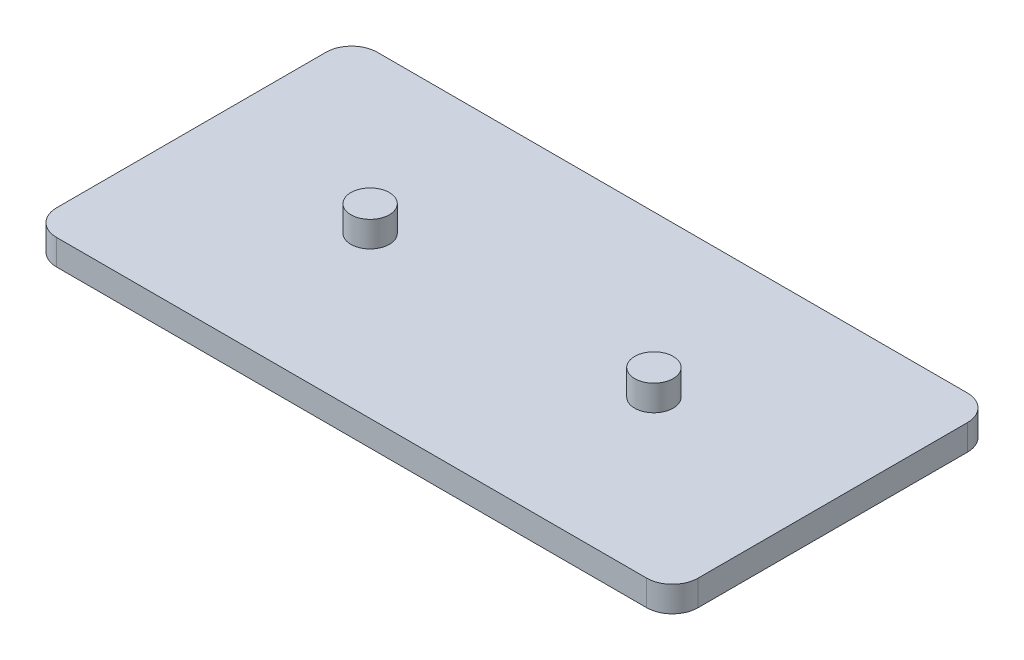
ISO-10303-21;
HEADER;
FILE_DESCRIPTION(('STEP AP214'),'2;1');
FILE_NAME('part.step','',(''),(''),'','','');
FILE_SCHEMA(('AUTOMOTIVE_DESIGN { 1 0 10303 214 1 1 1 1 }'));
ENDSEC;
DATA;
#1=APPLICATION_CONTEXT('core data for automotive mechanical design processes');
#2=APPLICATION_PROTOCOL_DEFINITION('international standard','automotive_design',2000,#1);
#3=PRODUCT_CONTEXT('',#1,'mechanical');
#4=PRODUCT('Part','Part','',(#3));
#5=PRODUCT_RELATED_PRODUCT_CATEGORY('part','',(#4));
#6=PRODUCT_DEFINITION_FORMATION('','',#4);
#7=PRODUCT_DEFINITION_CONTEXT('part definition',#1,'design');
#8=PRODUCT_DEFINITION('design','',#6,#7);
#9=PRODUCT_DEFINITION_SHAPE('','',#8);
#10=(LENGTH_UNIT() NAMED_UNIT(*) SI_UNIT(.MILLI.,.METRE.));
#11=(NAMED_UNIT(*) PLANE_ANGLE_UNIT() SI_UNIT($,.RADIAN.));
#12=(NAMED_UNIT(*) SI_UNIT($,.STERADIAN.) SOLID_ANGLE_UNIT());
#13=UNCERTAINTY_MEASURE_WITH_UNIT(LENGTH_MEASURE(1.E-05),#10,'distance_accuracy_value','');
#14=(GEOMETRIC_REPRESENTATION_CONTEXT(3) GLOBAL_UNCERTAINTY_ASSIGNED_CONTEXT((#13)) GLOBAL_UNIT_ASSIGNED_CONTEXT((#10,
#11,#12)) REPRESENTATION_CONTEXT('',''));
#15=CARTESIAN_POINT('',(0.,0.,0.));
#16=DIRECTION('',(0.,0.,1.));
#17=DIRECTION('',(1.,0.,0.));
#18=AXIS2_PLACEMENT_3D('',#15,#16,#17);
#19=CARTESIAN_POINT('',(317.5,25.4,-158.75));
#20=DIRECTION('',(-1.,0.,0.));
#21=DIRECTION('',(0.,0.,1.));
#22=AXIS2_PLACEMENT_3D('',#19,#20,#21);
#23=PLANE('',#22);
#24=DIRECTION('',(0.,0.,-1.));
#25=VECTOR('',#24,1.);
#26=CARTESIAN_POINT('',(317.5,0.,-158.75));
#27=LINE('',#26,#25);
#28=CARTESIAN_POINT('',(317.5,0.,133.35));
#29=VERTEX_POINT('',#28);
#30=CARTESIAN_POINT('',(317.5,0.,-133.35));
#31=VERTEX_POINT('',#30);
#32=EDGE_CURVE('E157',#29,#31,#27,.T.);
#33=ORIENTED_EDGE('',*,*,#32,.T.);
#34=DIRECTION('',(0.,-1.,0.));
#35=VECTOR('',#34,1.);
#36=CARTESIAN_POINT('',(317.5,25.4,-133.35));
#37=LINE('',#36,#35);
#38=CARTESIAN_POINT('',(317.5,25.4,-133.35));
#39=VERTEX_POINT('',#38);
#40=EDGE_CURVE('E11',#31,#39,#37,.F.);
#41=ORIENTED_EDGE('',*,*,#40,.T.);
#42=DIRECTION('',(0.,0.,-1.));
#43=VECTOR('',#42,1.);
#44=CARTESIAN_POINT('',(317.5,25.4,-158.75));
#45=LINE('',#44,#43);
#46=CARTESIAN_POINT('',(317.5,25.4,133.35));
#47=VERTEX_POINT('',#46);
#48=EDGE_CURVE('E125',#47,#39,#45,.T.);
#49=ORIENTED_EDGE('',*,*,#48,.F.);
#50=DIRECTION('',(0.,-1.,0.));
#51=VECTOR('',#50,1.);
#52=CARTESIAN_POINT('',(317.5,25.4,133.35));
#53=LINE('',#52,#51);
#54=EDGE_CURVE('E41',#47,#29,#53,.T.);
#55=ORIENTED_EDGE('',*,*,#54,.T.);
#56=EDGE_LOOP('',(#33,#41,#49,#55));
#57=FACE_BOUND('',#56,.T.);
#58=ADVANCED_FACE('F33',(#57),#23,.F.);
#59=CARTESIAN_POINT('',(-317.5,25.4,-158.75));
#60=DIRECTION('',(0.,0.,1.));
#61=DIRECTION('',(1.,0.,0.));
#62=AXIS2_PLACEMENT_3D('',#59,#60,#61);
#63=PLANE('',#62);
#64=DIRECTION('',(-1.,0.,0.));
#65=VECTOR('',#64,1.);
#66=CARTESIAN_POINT('',(-317.5,0.,-158.75));
#67=LINE('',#66,#65);
#68=CARTESIAN_POINT('',(292.1,0.,-158.75));
#69=VERTEX_POINT('',#68);
#70=CARTESIAN_POINT('',(-292.1,0.,-158.75));
#71=VERTEX_POINT('',#70);
#72=EDGE_CURVE('E130',#69,#71,#67,.T.);
#73=ORIENTED_EDGE('',*,*,#72,.T.);
#74=DIRECTION('',(0.,-1.,0.));
#75=VECTOR('',#74,1.);
#76=CARTESIAN_POINT('',(-292.1,25.4,-158.75));
#77=LINE('',#76,#75);
#78=CARTESIAN_POINT('',(-292.1,25.4,-158.75));
#79=VERTEX_POINT('',#78);
#80=EDGE_CURVE('E48',#71,#79,#77,.F.);
#81=ORIENTED_EDGE('',*,*,#80,.T.);
#82=DIRECTION('',(-1.,0.,0.));
#83=VECTOR('',#82,1.);
#84=CARTESIAN_POINT('',(-317.5,25.4,-158.75));
#85=LINE('',#84,#83);
#86=CARTESIAN_POINT('',(292.1,25.4,-158.75));
#87=VERTEX_POINT('',#86);
#88=EDGE_CURVE('E128',#87,#79,#85,.T.);
#89=ORIENTED_EDGE('',*,*,#88,.F.);
#90=DIRECTION('',(0.,-1.,0.));
#91=VECTOR('',#90,1.);
#92=CARTESIAN_POINT('',(292.1,25.4,-158.75));
#93=LINE('',#92,#91);
#94=EDGE_CURVE('E149',#87,#69,#93,.T.);
#95=ORIENTED_EDGE('',*,*,#94,.T.);
#96=EDGE_LOOP('',(#73,#81,#89,#95));
#97=FACE_BOUND('',#96,.T.);
#98=ADVANCED_FACE('F203',(#97),#63,.F.);
#99=CARTESIAN_POINT('',(-317.5,25.4,-158.75));
#100=DIRECTION('',(1.,0.,0.));
#101=DIRECTION('',(0.,0.,-1.));
#102=AXIS2_PLACEMENT_3D('',#99,#100,#101);
#103=PLANE('',#102);
#104=DIRECTION('',(0.,0.,1.));
#105=VECTOR('',#104,1.);
#106=CARTESIAN_POINT('',(-317.5,0.,-158.75));
#107=LINE('',#106,#105);
#108=CARTESIAN_POINT('',(-317.5,0.,-133.35));
#109=VERTEX_POINT('',#108);
#110=CARTESIAN_POINT('',(-317.5,0.,133.35));
#111=VERTEX_POINT('',#110);
#112=EDGE_CURVE('E126',#109,#111,#107,.T.);
#113=ORIENTED_EDGE('',*,*,#112,.T.);
#114=DIRECTION('',(0.,-1.,0.));
#115=VECTOR('',#114,1.);
#116=CARTESIAN_POINT('',(-317.5,25.4,133.35));
#117=LINE('',#116,#115);
#118=CARTESIAN_POINT('',(-317.5,25.4,133.35));
#119=VERTEX_POINT('',#118);
#120=EDGE_CURVE('E104',#111,#119,#117,.F.);
#121=ORIENTED_EDGE('',*,*,#120,.T.);
#122=DIRECTION('',(0.,0.,1.));
#123=VECTOR('',#122,1.);
#124=CARTESIAN_POINT('',(-317.5,25.4,-158.75));
#125=LINE('',#124,#123);
#126=CARTESIAN_POINT('',(-317.5,25.4,-133.35));
#127=VERTEX_POINT('',#126);
#128=EDGE_CURVE('E169',#127,#119,#125,.T.);
#129=ORIENTED_EDGE('',*,*,#128,.F.);
#130=DIRECTION('',(0.,-1.,0.));
#131=VECTOR('',#130,1.);
#132=CARTESIAN_POINT('',(-317.5,25.4,-133.35));
#133=LINE('',#132,#131);
#134=EDGE_CURVE('E109',#127,#109,#133,.T.);
#135=ORIENTED_EDGE('',*,*,#134,.T.);
#136=EDGE_LOOP('',(#113,#121,#129,#135));
#137=FACE_BOUND('',#136,.T.);
#138=ADVANCED_FACE('F200',(#137),#103,.F.);
#139=CARTESIAN_POINT('',(-317.5,25.4,158.75));
#140=DIRECTION('',(0.,0.,-1.));
#141=DIRECTION('',(-1.,0.,0.));
#142=AXIS2_PLACEMENT_3D('',#139,#140,#141);
#143=PLANE('',#142);
#144=DIRECTION('',(1.,0.,0.));
#145=VECTOR('',#144,1.);
#146=CARTESIAN_POINT('',(-317.5,25.4,158.75));
#147=LINE('',#146,#145);
#148=CARTESIAN_POINT('',(-292.1,25.4,158.75));
#149=VERTEX_POINT('',#148);
#150=CARTESIAN_POINT('',(292.1,25.4,158.75));
#151=VERTEX_POINT('',#150);
#152=EDGE_CURVE('E119',#149,#151,#147,.T.);
#153=ORIENTED_EDGE('',*,*,#152,.F.);
#154=DIRECTION('',(0.,-1.,0.));
#155=VECTOR('',#154,1.);
#156=CARTESIAN_POINT('',(-292.1,25.4,158.75));
#157=LINE('',#156,#155);
#158=CARTESIAN_POINT('',(-292.1,0.,158.75));
#159=VERTEX_POINT('',#158);
#160=EDGE_CURVE('E103',#149,#159,#157,.T.);
#161=ORIENTED_EDGE('',*,*,#160,.T.);
#162=DIRECTION('',(1.,0.,0.));
#163=VECTOR('',#162,1.);
#164=CARTESIAN_POINT('',(-317.5,0.,158.75));
#165=LINE('',#164,#163);
#166=CARTESIAN_POINT('',(292.1,0.,158.75));
#167=VERTEX_POINT('',#166);
#168=EDGE_CURVE('E116',#159,#167,#165,.T.);
#169=ORIENTED_EDGE('',*,*,#168,.T.);
#170=DIRECTION('',(0.,-1.,0.));
#171=VECTOR('',#170,1.);
#172=CARTESIAN_POINT('',(292.1,25.4,158.75));
#173=LINE('',#172,#171);
#174=EDGE_CURVE('E121',#167,#151,#173,.F.);
#175=ORIENTED_EDGE('',*,*,#174,.T.);
#176=EDGE_LOOP('',(#153,#161,#169,#175));
#177=FACE_BOUND('',#176,.T.);
#178=ADVANCED_FACE('F115',(#177),#143,.F.);
#179=CARTESIAN_POINT('',(0.,25.4,0.));
#180=DIRECTION('',(0.,1.,0.));
#181=DIRECTION('',(0.,0.,1.));
#182=AXIS2_PLACEMENT_3D('',#179,#180,#181);
#183=PLANE('',#182);
#184=CARTESIAN_POINT('',(140.462,25.4,0.));
#185=DIRECTION('',(0.,1.,0.));
#186=DIRECTION('',(0.,0.,-1.));
#187=AXIS2_PLACEMENT_3D('',#184,#185,#186);
#188=CIRCLE('',#187,19.05);
#189=CARTESIAN_POINT('',(140.462,25.4,-19.05));
#190=VERTEX_POINT('',#189);
#191=EDGE_CURVE('E176',#190,#190,#188,.T.);
#192=ORIENTED_EDGE('',*,*,#191,.F.);
#193=EDGE_LOOP('',(#192));
#194=FACE_BOUND('',#193,.T.);
#195=CARTESIAN_POINT('',(-140.462,25.4,0.));
#196=DIRECTION('',(0.,1.,0.));
#197=DIRECTION('',(0.,0.,1.));
#198=AXIS2_PLACEMENT_3D('',#195,#196,#197);
#199=CIRCLE('',#198,19.05);
#200=CARTESIAN_POINT('',(-140.462,25.4,19.05));
#201=VERTEX_POINT('',#200);
#202=EDGE_CURVE('E165',#201,#201,#199,.T.);
#203=ORIENTED_EDGE('',*,*,#202,.F.);
#204=EDGE_LOOP('',(#203));
#205=FACE_BOUND('',#204,.T.);
#206=ORIENTED_EDGE('',*,*,#128,.T.);
#207=CARTESIAN_POINT('',(-292.1,25.4,133.35));
#208=DIRECTION('',(0.,1.,0.));
#209=DIRECTION('',(0.,0.,1.));
#210=AXIS2_PLACEMENT_3D('',#207,#208,#209);
#211=CIRCLE('',#210,25.4);
#212=EDGE_CURVE('E147',#119,#149,#211,.T.);
#213=ORIENTED_EDGE('',*,*,#212,.T.);
#214=ORIENTED_EDGE('',*,*,#152,.T.);
#215=CARTESIAN_POINT('',(292.1,25.4,133.35));
#216=DIRECTION('',(0.,1.,0.));
#217=DIRECTION('',(0.,0.,1.));
#218=AXIS2_PLACEMENT_3D('',#215,#216,#217);
#219=CIRCLE('',#218,25.4);
#220=EDGE_CURVE('E142',#151,#47,#219,.T.);
#221=ORIENTED_EDGE('',*,*,#220,.T.);
#222=ORIENTED_EDGE('',*,*,#48,.T.);
#223=CARTESIAN_POINT('',(292.1,25.4,-133.35));
#224=DIRECTION('',(0.,1.,0.));
#225=DIRECTION('',(0.,0.,1.));
#226=AXIS2_PLACEMENT_3D('',#223,#224,#225);
#227=CIRCLE('',#226,25.4);
#228=EDGE_CURVE('E55',#39,#87,#227,.T.);
#229=ORIENTED_EDGE('',*,*,#228,.T.);
#230=ORIENTED_EDGE('',*,*,#88,.T.);
#231=CARTESIAN_POINT('',(-292.1,25.4,-133.35));
#232=DIRECTION('',(0.,1.,0.));
#233=DIRECTION('',(0.,0.,1.));
#234=AXIS2_PLACEMENT_3D('',#231,#232,#233);
#235=CIRCLE('',#234,25.4);
#236=EDGE_CURVE('E145',#79,#127,#235,.T.);
#237=ORIENTED_EDGE('',*,*,#236,.T.);
#238=EDGE_LOOP('',(#206,#213,#214,#221,#222,#229,#230,#237));
#239=FACE_BOUND('',#238,.T.);
#240=ADVANCED_FACE('F191',(#194,#205,#239),#183,.T.);
#241=CARTESIAN_POINT('',(0.,0.,0.));
#242=DIRECTION('',(0.,1.,0.));
#243=DIRECTION('',(0.,0.,1.));
#244=AXIS2_PLACEMENT_3D('',#241,#242,#243);
#245=PLANE('',#244);
#246=ORIENTED_EDGE('',*,*,#168,.F.);
#247=CARTESIAN_POINT('',(-292.1,0.,133.35));
#248=DIRECTION('',(0.,1.,0.));
#249=DIRECTION('',(0.,0.,1.));
#250=AXIS2_PLACEMENT_3D('',#247,#248,#249);
#251=CIRCLE('',#250,25.4);
#252=EDGE_CURVE('E99',#159,#111,#251,.F.);
#253=ORIENTED_EDGE('',*,*,#252,.T.);
#254=ORIENTED_EDGE('',*,*,#112,.F.);
#255=CARTESIAN_POINT('',(-292.1,0.,-133.35));
#256=DIRECTION('',(0.,1.,0.));
#257=DIRECTION('',(0.,0.,1.));
#258=AXIS2_PLACEMENT_3D('',#255,#256,#257);
#259=CIRCLE('',#258,25.4);
#260=EDGE_CURVE('E110',#109,#71,#259,.F.);
#261=ORIENTED_EDGE('',*,*,#260,.T.);
#262=ORIENTED_EDGE('',*,*,#72,.F.);
#263=CARTESIAN_POINT('',(292.1,0.,-133.35));
#264=DIRECTION('',(0.,1.,0.));
#265=DIRECTION('',(0.,0.,1.));
#266=AXIS2_PLACEMENT_3D('',#263,#264,#265);
#267=CIRCLE('',#266,25.4);
#268=EDGE_CURVE('E136',#69,#31,#267,.F.);
#269=ORIENTED_EDGE('',*,*,#268,.T.);
#270=ORIENTED_EDGE('',*,*,#32,.F.);
#271=CARTESIAN_POINT('',(292.1,0.,133.35));
#272=DIRECTION('',(0.,1.,0.));
#273=DIRECTION('',(0.,0.,1.));
#274=AXIS2_PLACEMENT_3D('',#271,#272,#273);
#275=CIRCLE('',#274,25.4);
#276=EDGE_CURVE('E120',#29,#167,#275,.F.);
#277=ORIENTED_EDGE('',*,*,#276,.T.);
#278=EDGE_LOOP('',(#246,#253,#254,#261,#262,#269,#270,#277));
#279=FACE_BOUND('',#278,.T.);
#280=ADVANCED_FACE('F123',(#279),#245,.F.);
#281=CARTESIAN_POINT('',(-140.462,50.8,0.));
#282=DIRECTION('',(0.,-1.,0.));
#283=DIRECTION('',(0.,0.,-1.));
#284=AXIS2_PLACEMENT_3D('',#281,#282,#283);
#285=CYLINDRICAL_SURFACE('',#284,19.05);
#286=CARTESIAN_POINT('',(-140.462,50.8,0.));
#287=DIRECTION('',(0.,1.,0.));
#288=DIRECTION('',(0.,0.,1.));
#289=AXIS2_PLACEMENT_3D('',#286,#287,#288);
#290=CIRCLE('',#289,19.05);
#291=CARTESIAN_POINT('',(-140.462,50.8,19.05));
#292=VERTEX_POINT('',#291);
#293=EDGE_CURVE('E162',#292,#292,#290,.T.);
#294=ORIENTED_EDGE('',*,*,#293,.F.);
#295=EDGE_LOOP('',(#294));
#296=FACE_BOUND('',#295,.T.);
#297=ORIENTED_EDGE('',*,*,#202,.T.);
#298=EDGE_LOOP('',(#297));
#299=FACE_BOUND('',#298,.T.);
#300=ADVANCED_FACE('F263',(#296,#299),#285,.T.);
#301=CARTESIAN_POINT('',(-140.462,50.8,0.));
#302=DIRECTION('',(0.,1.,0.));
#303=DIRECTION('',(0.,0.,1.));
#304=AXIS2_PLACEMENT_3D('',#301,#302,#303);
#305=PLANE('',#304);
#306=ORIENTED_EDGE('',*,*,#293,.T.);
#307=EDGE_LOOP('',(#306));
#308=FACE_BOUND('',#307,.T.);
#309=ADVANCED_FACE('F187',(#308),#305,.T.);
#310=CARTESIAN_POINT('',(140.462,50.8,0.));
#311=DIRECTION('',(0.,-1.,0.));
#312=DIRECTION('',(0.,0.,-1.));
#313=AXIS2_PLACEMENT_3D('',#310,#311,#312);
#314=CYLINDRICAL_SURFACE('',#313,19.05);
#315=CARTESIAN_POINT('',(140.462,50.8,0.));
#316=DIRECTION('',(0.,1.,0.));
#317=DIRECTION('',(0.,0.,-1.));
#318=AXIS2_PLACEMENT_3D('',#315,#316,#317);
#319=CIRCLE('',#318,19.05);
#320=CARTESIAN_POINT('',(140.462,50.8,-19.05));
#321=VERTEX_POINT('',#320);
#322=EDGE_CURVE('E174',#321,#321,#319,.T.);
#323=ORIENTED_EDGE('',*,*,#322,.F.);
#324=EDGE_LOOP('',(#323));
#325=FACE_BOUND('',#324,.T.);
#326=ORIENTED_EDGE('',*,*,#191,.T.);
#327=EDGE_LOOP('',(#326));
#328=FACE_BOUND('',#327,.T.);
#329=ADVANCED_FACE('F184',(#325,#328),#314,.T.);
#330=CARTESIAN_POINT('',(140.462,50.8,0.));
#331=DIRECTION('',(0.,-1.,0.));
#332=DIRECTION('',(0.,0.,-1.));
#333=AXIS2_PLACEMENT_3D('',#330,#331,#332);
#334=PLANE('',#333);
#335=ORIENTED_EDGE('',*,*,#322,.T.);
#336=EDGE_LOOP('',(#335));
#337=FACE_BOUND('',#336,.T.);
#338=ADVANCED_FACE('F182',(#337),#334,.F.);
#339=CARTESIAN_POINT('',(-292.1,25.4,133.35));
#340=DIRECTION('',(0.,-1.,0.));
#341=DIRECTION('',(0.,0.,-1.));
#342=AXIS2_PLACEMENT_3D('',#339,#340,#341);
#343=CYLINDRICAL_SURFACE('',#342,25.4);
#344=ORIENTED_EDGE('',*,*,#212,.F.);
#345=ORIENTED_EDGE('',*,*,#120,.F.);
#346=ORIENTED_EDGE('',*,*,#252,.F.);
#347=ORIENTED_EDGE('',*,*,#160,.F.);
#348=EDGE_LOOP('',(#344,#345,#346,#347));
#349=FACE_BOUND('',#348,.T.);
#350=ADVANCED_FACE('F102',(#349),#343,.T.);
#351=CARTESIAN_POINT('',(-292.1,25.4,-133.35));
#352=DIRECTION('',(0.,-1.,0.));
#353=DIRECTION('',(0.,0.,-1.));
#354=AXIS2_PLACEMENT_3D('',#351,#352,#353);
#355=CYLINDRICAL_SURFACE('',#354,25.4);
#356=ORIENTED_EDGE('',*,*,#236,.F.);
#357=ORIENTED_EDGE('',*,*,#80,.F.);
#358=ORIENTED_EDGE('',*,*,#260,.F.);
#359=ORIENTED_EDGE('',*,*,#134,.F.);
#360=EDGE_LOOP('',(#356,#357,#358,#359));
#361=FACE_BOUND('',#360,.T.);
#362=ADVANCED_FACE('F202',(#361),#355,.T.);
#363=CARTESIAN_POINT('',(292.1,25.4,-133.35));
#364=DIRECTION('',(0.,-1.,0.));
#365=DIRECTION('',(0.,0.,-1.));
#366=AXIS2_PLACEMENT_3D('',#363,#364,#365);
#367=CYLINDRICAL_SURFACE('',#366,25.4);
#368=ORIENTED_EDGE('',*,*,#228,.F.);
#369=ORIENTED_EDGE('',*,*,#40,.F.);
#370=ORIENTED_EDGE('',*,*,#268,.F.);
#371=ORIENTED_EDGE('',*,*,#94,.F.);
#372=EDGE_LOOP('',(#368,#369,#370,#371));
#373=FACE_BOUND('',#372,.T.);
#374=ADVANCED_FACE('F206',(#373),#367,.T.);
#375=CARTESIAN_POINT('',(292.1,25.4,133.35));
#376=DIRECTION('',(0.,-1.,0.));
#377=DIRECTION('',(0.,0.,-1.));
#378=AXIS2_PLACEMENT_3D('',#375,#376,#377);
#379=CYLINDRICAL_SURFACE('',#378,25.4);
#380=ORIENTED_EDGE('',*,*,#220,.F.);
#381=ORIENTED_EDGE('',*,*,#174,.F.);
#382=ORIENTED_EDGE('',*,*,#276,.F.);
#383=ORIENTED_EDGE('',*,*,#54,.F.);
#384=EDGE_LOOP('',(#380,#381,#382,#383));
#385=FACE_BOUND('',#384,.T.);
#386=ADVANCED_FACE('F35',(#385),#379,.T.);
#387=CLOSED_SHELL('',(#58,#98,#138,#178,#240,#280,#300,#309,#329,#338,#350,#362,#374,#386));
#388=MANIFOLD_SOLID_BREP('B2',#387);
#389=ADVANCED_BREP_SHAPE_REPRESENTATION('',(#18,#388),#14);
#390=SHAPE_DEFINITION_REPRESENTATION(#9,#389);
ENDSEC;
END-ISO-10303-21;
